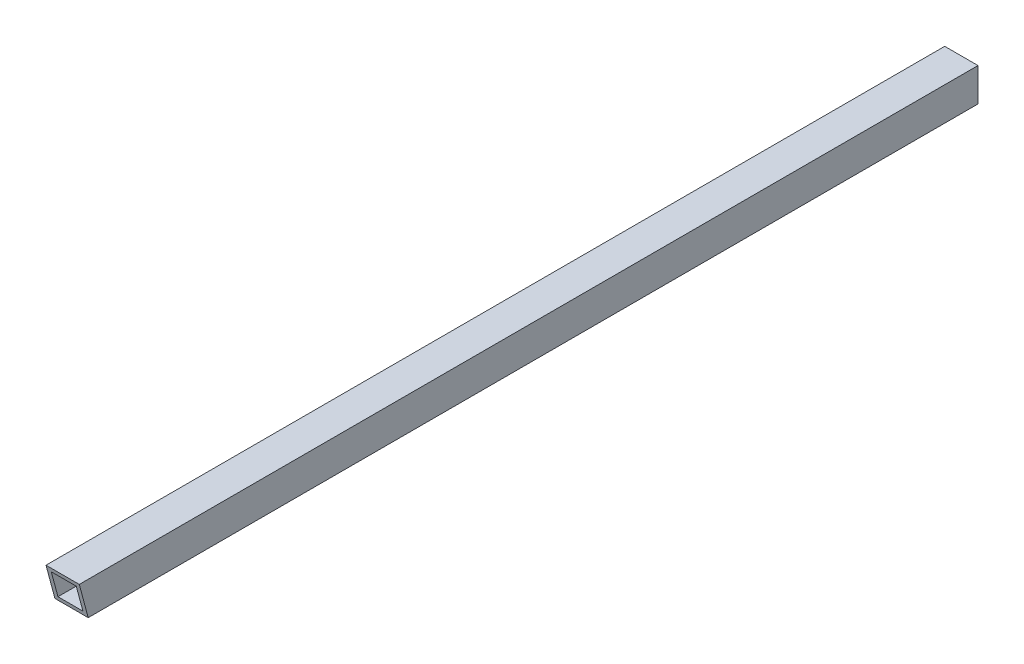
ISO-10303-21;
HEADER;
FILE_DESCRIPTION(('STEP AP214'),'2;1');
FILE_NAME('part.step','',(''),(''),'','','');
FILE_SCHEMA(('AUTOMOTIVE_DESIGN { 1 0 10303 214 1 1 1 1 }'));
ENDSEC;
DATA;
#1=APPLICATION_CONTEXT('core data for automotive mechanical design processes');
#2=APPLICATION_PROTOCOL_DEFINITION('international standard','automotive_design',2000,#1);
#3=PRODUCT_CONTEXT('',#1,'mechanical');
#4=PRODUCT('Part','Part','',(#3));
#5=PRODUCT_RELATED_PRODUCT_CATEGORY('part','',(#4));
#6=PRODUCT_DEFINITION_FORMATION('','',#4);
#7=PRODUCT_DEFINITION_CONTEXT('part definition',#1,'design');
#8=PRODUCT_DEFINITION('design','',#6,#7);
#9=PRODUCT_DEFINITION_SHAPE('','',#8);
#10=(LENGTH_UNIT() NAMED_UNIT(*) SI_UNIT(.MILLI.,.METRE.));
#11=(NAMED_UNIT(*) PLANE_ANGLE_UNIT() SI_UNIT($,.RADIAN.));
#12=(NAMED_UNIT(*) SI_UNIT($,.STERADIAN.) SOLID_ANGLE_UNIT());
#13=UNCERTAINTY_MEASURE_WITH_UNIT(LENGTH_MEASURE(1.E-05),#10,'distance_accuracy_value','');
#14=(GEOMETRIC_REPRESENTATION_CONTEXT(3) GLOBAL_UNCERTAINTY_ASSIGNED_CONTEXT((#13)) GLOBAL_UNIT_ASSIGNED_CONTEXT((#10,
#11,#12)) REPRESENTATION_CONTEXT('',''));
#15=CARTESIAN_POINT('',(0.,0.,0.));
#16=DIRECTION('',(0.,0.,1.));
#17=DIRECTION('',(1.,0.,0.));
#18=AXIS2_PLACEMENT_3D('',#15,#16,#17);
#19=CARTESIAN_POINT('',(0.,0.,0.));
#20=DIRECTION('',(0.,0.,1.));
#21=DIRECTION('',(1.,0.,0.));
#22=AXIS2_PLACEMENT_3D('',#19,#20,#21);
#23=PLANE('',#22);
#24=DIRECTION('',(0.,-1.,0.));
#25=VECTOR('',#24,1.);
#26=CARTESIAN_POINT('',(-12.7,-12.7,0.));
#27=LINE('',#26,#25);
#28=CARTESIAN_POINT('',(-12.7,12.7,0.));
#29=VERTEX_POINT('',#28);
#30=CARTESIAN_POINT('',(-12.7,-12.7,0.));
#31=VERTEX_POINT('',#30);
#32=EDGE_CURVE('E135',#29,#31,#27,.T.);
#33=ORIENTED_EDGE('',*,*,#32,.F.);
#34=DIRECTION('',(-1.,0.,0.));
#35=VECTOR('',#34,1.);
#36=CARTESIAN_POINT('',(12.7,12.7,0.));
#37=LINE('',#36,#35);
#38=CARTESIAN_POINT('',(12.7,12.7,0.));
#39=VERTEX_POINT('',#38);
#40=EDGE_CURVE('E108',#39,#29,#37,.T.);
#41=ORIENTED_EDGE('',*,*,#40,.F.);
#42=DIRECTION('',(0.,1.,0.));
#43=VECTOR('',#42,1.);
#44=CARTESIAN_POINT('',(12.7,-12.7,0.));
#45=LINE('',#44,#43);
#46=CARTESIAN_POINT('',(12.7,-12.7,0.));
#47=VERTEX_POINT('',#46);
#48=EDGE_CURVE('E136',#47,#39,#45,.T.);
#49=ORIENTED_EDGE('',*,*,#48,.F.);
#50=DIRECTION('',(1.,0.,0.));
#51=VECTOR('',#50,1.);
#52=CARTESIAN_POINT('',(12.7,-12.7,0.));
#53=LINE('',#52,#51);
#54=EDGE_CURVE('E131',#31,#47,#53,.T.);
#55=ORIENTED_EDGE('',*,*,#54,.F.);
#56=EDGE_LOOP('',(#33,#41,#49,#55));
#57=FACE_BOUND('',#56,.T.);
#58=DIRECTION('',(0.,-1.,0.));
#59=VECTOR('',#58,1.);
#60=CARTESIAN_POINT('',(-9.525,-9.525,0.));
#61=LINE('',#60,#59);
#62=CARTESIAN_POINT('',(-9.525,9.52500000000001,0.));
#63=VERTEX_POINT('',#62);
#64=CARTESIAN_POINT('',(-9.525,-9.525,0.));
#65=VERTEX_POINT('',#64);
#66=EDGE_CURVE('E152',#63,#65,#61,.T.);
#67=ORIENTED_EDGE('',*,*,#66,.T.);
#68=DIRECTION('',(1.,0.,0.));
#69=VECTOR('',#68,1.);
#70=CARTESIAN_POINT('',(9.525,-9.525,0.));
#71=LINE('',#70,#69);
#72=CARTESIAN_POINT('',(9.525,-9.525,0.));
#73=VERTEX_POINT('',#72);
#74=EDGE_CURVE('E155',#65,#73,#71,.T.);
#75=ORIENTED_EDGE('',*,*,#74,.T.);
#76=DIRECTION('',(0.,1.,0.));
#77=VECTOR('',#76,1.);
#78=CARTESIAN_POINT('',(9.525,-9.525,0.));
#79=LINE('',#78,#77);
#80=CARTESIAN_POINT('',(9.525,9.52500000000001,0.));
#81=VERTEX_POINT('',#80);
#82=EDGE_CURVE('E158',#73,#81,#79,.T.);
#83=ORIENTED_EDGE('',*,*,#82,.T.);
#84=DIRECTION('',(-1.,0.,0.));
#85=VECTOR('',#84,1.);
#86=CARTESIAN_POINT('',(9.525,9.52500000000001,0.));
#87=LINE('',#86,#85);
#88=EDGE_CURVE('E161',#81,#63,#87,.T.);
#89=ORIENTED_EDGE('',*,*,#88,.T.);
#90=EDGE_LOOP('',(#67,#75,#83,#89));
#91=FACE_BOUND('',#90,.T.);
#92=ADVANCED_FACE('F32',(#57,#91),#23,.F.);
#93=CARTESIAN_POINT('',(-12.7,-12.7,685.8));
#94=DIRECTION('',(1.,0.,0.));
#95=DIRECTION('',(0.,0.,-1.));
#96=AXIS2_PLACEMENT_3D('',#93,#94,#95);
#97=PLANE('',#96);
#98=DIRECTION('',(0.,0.,-1.));
#99=VECTOR('',#98,1.);
#100=CARTESIAN_POINT('',(-12.7,-12.7,685.8));
#101=LINE('',#100,#99);
#102=CARTESIAN_POINT('',(-12.7,-12.7,678.99409051225));
#103=VERTEX_POINT('',#102);
#104=EDGE_CURVE('E40',#103,#31,#101,.T.);
#105=ORIENTED_EDGE('',*,*,#104,.F.);
#106=DIRECTION('',(0.,-0.965925826289072,-0.258819045102508));
#107=VECTOR('',#106,1.);
#108=CARTESIAN_POINT('',(-12.7,-12.7,678.99409051225));
#109=LINE('',#108,#107);
#110=CARTESIAN_POINT('',(-12.7,12.7,685.8));
#111=VERTEX_POINT('',#110);
#112=EDGE_CURVE('E99',#111,#103,#109,.T.);
#113=ORIENTED_EDGE('',*,*,#112,.F.);
#114=DIRECTION('',(0.,0.,-1.));
#115=VECTOR('',#114,1.);
#116=CARTESIAN_POINT('',(-12.7,12.7,685.8));
#117=LINE('',#116,#115);
#118=EDGE_CURVE('E107',#111,#29,#117,.T.);
#119=ORIENTED_EDGE('',*,*,#118,.T.);
#120=ORIENTED_EDGE('',*,*,#32,.T.);
#121=EDGE_LOOP('',(#105,#113,#119,#120));
#122=FACE_BOUND('',#121,.T.);
#123=ADVANCED_FACE('F34',(#122),#97,.F.);
#124=CARTESIAN_POINT('',(12.7,-12.7,685.8));
#125=DIRECTION('',(0.,1.,0.));
#126=DIRECTION('',(-1.,0.,0.));
#127=AXIS2_PLACEMENT_3D('',#124,#125,#126);
#128=PLANE('',#127);
#129=DIRECTION('',(0.,0.,-1.));
#130=VECTOR('',#129,1.);
#131=CARTESIAN_POINT('',(12.7,-12.7,685.8));
#132=LINE('',#131,#130);
#133=CARTESIAN_POINT('',(12.7,-12.7,678.99409051225));
#134=VERTEX_POINT('',#133);
#135=EDGE_CURVE('E121',#134,#47,#132,.T.);
#136=ORIENTED_EDGE('',*,*,#135,.F.);
#137=DIRECTION('',(1.,0.,0.));
#138=VECTOR('',#137,1.);
#139=CARTESIAN_POINT('',(12.7,-12.7,678.99409051225));
#140=LINE('',#139,#138);
#141=EDGE_CURVE('E115',#103,#134,#140,.T.);
#142=ORIENTED_EDGE('',*,*,#141,.F.);
#143=ORIENTED_EDGE('',*,*,#104,.T.);
#144=ORIENTED_EDGE('',*,*,#54,.T.);
#145=EDGE_LOOP('',(#136,#142,#143,#144));
#146=FACE_BOUND('',#145,.T.);
#147=ADVANCED_FACE('F130',(#146),#128,.F.);
#148=CARTESIAN_POINT('',(12.7,-12.7,685.8));
#149=DIRECTION('',(-1.,0.,0.));
#150=DIRECTION('',(0.,0.,1.));
#151=AXIS2_PLACEMENT_3D('',#148,#149,#150);
#152=PLANE('',#151);
#153=DIRECTION('',(0.,0.,-1.));
#154=VECTOR('',#153,1.);
#155=CARTESIAN_POINT('',(12.7,12.7,685.8));
#156=LINE('',#155,#154);
#157=CARTESIAN_POINT('',(12.7,12.7,685.8));
#158=VERTEX_POINT('',#157);
#159=EDGE_CURVE('E119',#158,#39,#156,.T.);
#160=ORIENTED_EDGE('',*,*,#159,.F.);
#161=DIRECTION('',(0.,0.965925826289072,0.258819045102508));
#162=VECTOR('',#161,1.);
#163=CARTESIAN_POINT('',(12.7,12.7,685.8));
#164=LINE('',#163,#162);
#165=EDGE_CURVE('E102',#134,#158,#164,.T.);
#166=ORIENTED_EDGE('',*,*,#165,.F.);
#167=ORIENTED_EDGE('',*,*,#135,.T.);
#168=ORIENTED_EDGE('',*,*,#48,.T.);
#169=EDGE_LOOP('',(#160,#166,#167,#168));
#170=FACE_BOUND('',#169,.T.);
#171=ADVANCED_FACE('F143',(#170),#152,.F.);
#172=CARTESIAN_POINT('',(12.7,12.7,685.8));
#173=DIRECTION('',(0.,-1.,0.));
#174=DIRECTION('',(1.,0.,0.));
#175=AXIS2_PLACEMENT_3D('',#172,#173,#174);
#176=PLANE('',#175);
#177=ORIENTED_EDGE('',*,*,#40,.T.);
#178=ORIENTED_EDGE('',*,*,#118,.F.);
#179=DIRECTION('',(-1.,0.,0.));
#180=VECTOR('',#179,1.);
#181=CARTESIAN_POINT('',(12.7,12.7,685.8));
#182=LINE('',#181,#180);
#183=EDGE_CURVE('E96',#158,#111,#182,.T.);
#184=ORIENTED_EDGE('',*,*,#183,.F.);
#185=ORIENTED_EDGE('',*,*,#159,.T.);
#186=EDGE_LOOP('',(#177,#178,#184,#185));
#187=FACE_BOUND('',#186,.T.);
#188=ADVANCED_FACE('F117',(#187),#176,.F.);
#189=CARTESIAN_POINT('',(-9.525,-9.525,685.8));
#190=DIRECTION('',(1.,0.,0.));
#191=DIRECTION('',(0.,0.,-1.));
#192=AXIS2_PLACEMENT_3D('',#189,#190,#191);
#193=PLANE('',#192);
#194=DIRECTION('',(0.,0.965925826289072,0.258819045102508));
#195=VECTOR('',#194,1.);
#196=CARTESIAN_POINT('',(-9.525,-8.0362072995547,680.24375));
#197=LINE('',#196,#195);
#198=CARTESIAN_POINT('',(-9.525,-9.525,679.844829198219));
#199=VERTEX_POINT('',#198);
#200=CARTESIAN_POINT('',(-9.525,9.52500000000001,684.949261314031));
#201=VERTEX_POINT('',#200);
#202=EDGE_CURVE('E46',#199,#201,#197,.T.);
#203=ORIENTED_EDGE('',*,*,#202,.F.);
#204=DIRECTION('',(0.,0.,-1.));
#205=VECTOR('',#204,1.);
#206=CARTESIAN_POINT('',(-9.525,-9.525,685.8));
#207=LINE('',#206,#205);
#208=EDGE_CURVE('E138',#199,#65,#207,.T.);
#209=ORIENTED_EDGE('',*,*,#208,.T.);
#210=ORIENTED_EDGE('',*,*,#66,.F.);
#211=DIRECTION('',(0.,0.,-1.));
#212=VECTOR('',#211,1.);
#213=CARTESIAN_POINT('',(-9.525,9.52500000000001,685.8));
#214=LINE('',#213,#212);
#215=EDGE_CURVE('E53',#201,#63,#214,.T.);
#216=ORIENTED_EDGE('',*,*,#215,.F.);
#217=EDGE_LOOP('',(#203,#209,#210,#216));
#218=FACE_BOUND('',#217,.T.);
#219=ADVANCED_FACE('F179',(#218),#193,.T.);
#220=CARTESIAN_POINT('',(9.525,-9.525,685.8));
#221=DIRECTION('',(0.,1.,0.));
#222=DIRECTION('',(0.,0.,1.));
#223=AXIS2_PLACEMENT_3D('',#220,#221,#222);
#224=PLANE('',#223);
#225=DIRECTION('',(-1.,0.,0.));
#226=VECTOR('',#225,1.);
#227=CARTESIAN_POINT('',(9.525,-9.525,679.844829198219));
#228=LINE('',#227,#226);
#229=CARTESIAN_POINT('',(9.525,-9.525,679.844829198219));
#230=VERTEX_POINT('',#229);
#231=EDGE_CURVE('E149',#230,#199,#228,.T.);
#232=ORIENTED_EDGE('',*,*,#231,.F.);
#233=DIRECTION('',(0.,0.,-1.));
#234=VECTOR('',#233,1.);
#235=CARTESIAN_POINT('',(9.525,-9.525,685.8));
#236=LINE('',#235,#234);
#237=EDGE_CURVE('E140',#230,#73,#236,.T.);
#238=ORIENTED_EDGE('',*,*,#237,.T.);
#239=ORIENTED_EDGE('',*,*,#74,.F.);
#240=ORIENTED_EDGE('',*,*,#208,.F.);
#241=EDGE_LOOP('',(#232,#238,#239,#240));
#242=FACE_BOUND('',#241,.T.);
#243=ADVANCED_FACE('F172',(#242),#224,.T.);
#244=CARTESIAN_POINT('',(9.525,-9.525,685.8));
#245=DIRECTION('',(-1.,0.,0.));
#246=DIRECTION('',(0.,0.,1.));
#247=AXIS2_PLACEMENT_3D('',#244,#245,#246);
#248=PLANE('',#247);
#249=DIRECTION('',(0.,-0.965925826289072,-0.258819045102508));
#250=VECTOR('',#249,1.);
#251=CARTESIAN_POINT('',(9.525,-8.0362072995547,680.24375));
#252=LINE('',#251,#250);
#253=CARTESIAN_POINT('',(9.525,9.52500000000001,684.949261314031));
#254=VERTEX_POINT('',#253);
#255=EDGE_CURVE('E147',#254,#230,#252,.T.);
#256=ORIENTED_EDGE('',*,*,#255,.F.);
#257=DIRECTION('',(0.,0.,-1.));
#258=VECTOR('',#257,1.);
#259=CARTESIAN_POINT('',(9.525,9.52500000000001,685.8));
#260=LINE('',#259,#258);
#261=EDGE_CURVE('E165',#254,#81,#260,.T.);
#262=ORIENTED_EDGE('',*,*,#261,.T.);
#263=ORIENTED_EDGE('',*,*,#82,.F.);
#264=ORIENTED_EDGE('',*,*,#237,.F.);
#265=EDGE_LOOP('',(#256,#262,#263,#264));
#266=FACE_BOUND('',#265,.T.);
#267=ADVANCED_FACE('F176',(#266),#248,.T.);
#268=CARTESIAN_POINT('',(9.525,9.52500000000001,685.8));
#269=DIRECTION('',(0.,-1.,0.));
#270=DIRECTION('',(0.,0.,-1.));
#271=AXIS2_PLACEMENT_3D('',#268,#269,#270);
#272=PLANE('',#271);
#273=DIRECTION('',(1.,0.,0.));
#274=VECTOR('',#273,1.);
#275=CARTESIAN_POINT('',(9.525,9.52500000000001,684.949261314031));
#276=LINE('',#275,#274);
#277=EDGE_CURVE('E11',#201,#254,#276,.T.);
#278=ORIENTED_EDGE('',*,*,#277,.F.);
#279=ORIENTED_EDGE('',*,*,#215,.T.);
#280=ORIENTED_EDGE('',*,*,#88,.F.);
#281=ORIENTED_EDGE('',*,*,#261,.F.);
#282=EDGE_LOOP('',(#278,#279,#280,#281));
#283=FACE_BOUND('',#282,.T.);
#284=ADVANCED_FACE('F227',(#283),#272,.T.);
#285=CARTESIAN_POINT('',(0.,-170.599261314024,636.685110957688));
#286=DIRECTION('',(0.,0.258819045102508,-0.965925826289072));
#287=DIRECTION('',(0.,0.965925826289072,0.258819045102508));
#288=AXIS2_PLACEMENT_3D('',#285,#286,#287);
#289=PLANE('',#288);
#290=ORIENTED_EDGE('',*,*,#202,.T.);
#291=ORIENTED_EDGE('',*,*,#277,.T.);
#292=ORIENTED_EDGE('',*,*,#255,.T.);
#293=ORIENTED_EDGE('',*,*,#231,.T.);
#294=EDGE_LOOP('',(#290,#291,#292,#293));
#295=FACE_BOUND('',#294,.T.);
#296=ORIENTED_EDGE('',*,*,#165,.T.);
#297=ORIENTED_EDGE('',*,*,#183,.T.);
#298=ORIENTED_EDGE('',*,*,#112,.T.);
#299=ORIENTED_EDGE('',*,*,#141,.T.);
#300=EDGE_LOOP('',(#296,#297,#298,#299));
#301=FACE_BOUND('',#300,.T.);
#302=ADVANCED_FACE('F98',(#295,#301),#289,.F.);
#303=CLOSED_SHELL('',(#92,#123,#147,#171,#188,#219,#243,#267,#284,#302));
#304=MANIFOLD_SOLID_BREP('B2',#303);
#305=ADVANCED_BREP_SHAPE_REPRESENTATION('',(#18,#304),#14);
#306=SHAPE_DEFINITION_REPRESENTATION(#9,#305);
ENDSEC;
END-ISO-10303-21;
